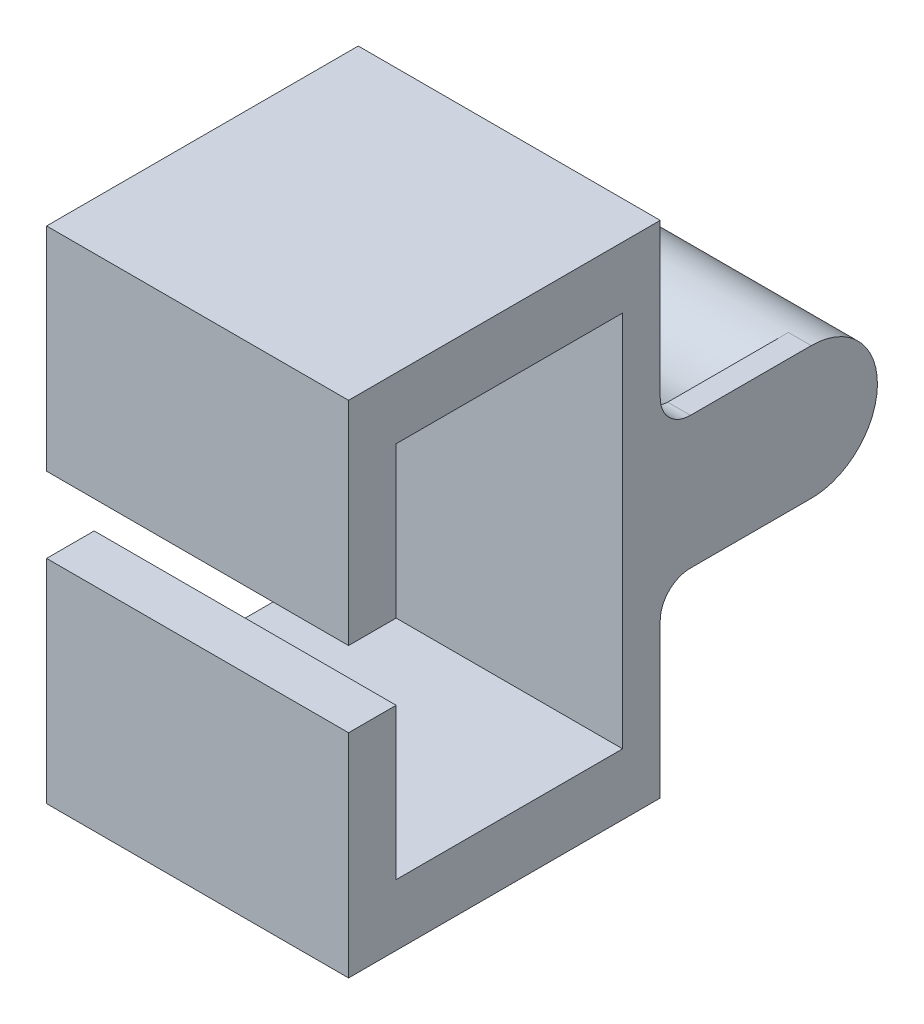
ISO-10303-21;
HEADER;
FILE_DESCRIPTION(('STEP AP214'),'2;1');
FILE_NAME('part.step','',(''),(''),'','','');
FILE_SCHEMA(('AUTOMOTIVE_DESIGN { 1 0 10303 214 1 1 1 1 }'));
ENDSEC;
DATA;
#1=APPLICATION_CONTEXT('core data for automotive mechanical design processes');
#2=APPLICATION_PROTOCOL_DEFINITION('international standard','automotive_design',2000,#1);
#3=PRODUCT_CONTEXT('',#1,'mechanical');
#4=PRODUCT('Part','Part','',(#3));
#5=PRODUCT_RELATED_PRODUCT_CATEGORY('part','',(#4));
#6=PRODUCT_DEFINITION_FORMATION('','',#4);
#7=PRODUCT_DEFINITION_CONTEXT('part definition',#1,'design');
#8=PRODUCT_DEFINITION('design','',#6,#7);
#9=PRODUCT_DEFINITION_SHAPE('','',#8);
#10=(LENGTH_UNIT() NAMED_UNIT(*) SI_UNIT(.MILLI.,.METRE.));
#11=(NAMED_UNIT(*) PLANE_ANGLE_UNIT() SI_UNIT($,.RADIAN.));
#12=(NAMED_UNIT(*) SI_UNIT($,.STERADIAN.) SOLID_ANGLE_UNIT());
#13=UNCERTAINTY_MEASURE_WITH_UNIT(LENGTH_MEASURE(1.E-05),#10,'distance_accuracy_value','');
#14=(GEOMETRIC_REPRESENTATION_CONTEXT(3) GLOBAL_UNCERTAINTY_ASSIGNED_CONTEXT((#13)) GLOBAL_UNIT_ASSIGNED_CONTEXT((#10,
#11,#12)) REPRESENTATION_CONTEXT('',''));
#15=CARTESIAN_POINT('',(0.,0.,0.));
#16=DIRECTION('',(0.,0.,1.));
#17=DIRECTION('',(1.,0.,0.));
#18=AXIS2_PLACEMENT_3D('',#15,#16,#17);
#19=CARTESIAN_POINT('',(50.8,-31.75,25.4));
#20=DIRECTION('',(0.,0.,1.));
#21=DIRECTION('',(1.,0.,0.));
#22=AXIS2_PLACEMENT_3D('',#19,#20,#21);
#23=PLANE('',#22);
#24=DIRECTION('',(0.,1.,0.));
#25=VECTOR('',#24,1.);
#26=CARTESIAN_POINT('',(50.8,-31.75,25.4));
#27=LINE('',#26,#25);
#28=CARTESIAN_POINT('',(50.8,16.2161216276526,25.4));
#29=VERTEX_POINT('',#28);
#30=CARTESIAN_POINT('',(50.8,42.0823482396232,25.4));
#31=VERTEX_POINT('',#30);
#32=EDGE_CURVE('E360',#29,#31,#27,.T.);
#33=ORIENTED_EDGE('',*,*,#32,.F.);
#34=DIRECTION('',(1.,0.,0.));
#35=VECTOR('',#34,1.);
#36=CARTESIAN_POINT('',(50.8,16.2161216276526,25.4));
#37=LINE('',#36,#35);
#38=CARTESIAN_POINT('',(41.8853644342479,16.2161216276526,25.4));
#39=VERTEX_POINT('',#38);
#40=EDGE_CURVE('E422',#29,#39,#37,.F.);
#41=ORIENTED_EDGE('',*,*,#40,.T.);
#42=DIRECTION('',(0.,-1.,0.));
#43=VECTOR('',#42,1.);
#44=CARTESIAN_POINT('',(41.8853644342479,-11.1252,25.4));
#45=LINE('',#44,#43);
#46=CARTESIAN_POINT('',(41.8853644342479,-16.2052,25.4));
#47=VERTEX_POINT('',#46);
#48=EDGE_CURVE('E416',#39,#47,#45,.T.);
#49=ORIENTED_EDGE('',*,*,#48,.T.);
#50=DIRECTION('',(1.,0.,0.));
#51=VECTOR('',#50,1.);
#52=CARTESIAN_POINT('',(50.8,-16.2052,25.4));
#53=LINE('',#52,#51);
#54=CARTESIAN_POINT('',(50.8,-16.2052,25.4));
#55=VERTEX_POINT('',#54);
#56=EDGE_CURVE('E418',#47,#55,#53,.T.);
#57=ORIENTED_EDGE('',*,*,#56,.T.);
#58=CARTESIAN_POINT('',(50.8,-42.0823482396232,25.4));
#59=VERTEX_POINT('',#58);
#60=EDGE_CURVE('E353',#59,#55,#27,.T.);
#61=ORIENTED_EDGE('',*,*,#60,.F.);
#62=DIRECTION('',(-1.,0.,0.));
#63=VECTOR('',#62,1.);
#64=CARTESIAN_POINT('',(50.8,-42.0823482396232,25.4));
#65=LINE('',#64,#63);
#66=CARTESIAN_POINT('',(0.,-42.0823482396232,25.4));
#67=VERTEX_POINT('',#66);
#68=EDGE_CURVE('E316',#59,#67,#65,.T.);
#69=ORIENTED_EDGE('',*,*,#68,.T.);
#70=DIRECTION('',(0.,1.,0.));
#71=VECTOR('',#70,1.);
#72=CARTESIAN_POINT('',(0.,-31.75,25.4));
#73=LINE('',#72,#71);
#74=CARTESIAN_POINT('',(0.,-16.2052,25.4));
#75=VERTEX_POINT('',#74);
#76=EDGE_CURVE('E361',#67,#75,#73,.T.);
#77=ORIENTED_EDGE('',*,*,#76,.T.);
#78=DIRECTION('',(-1.,0.,0.));
#79=VECTOR('',#78,1.);
#80=CARTESIAN_POINT('',(50.8,-16.2052,25.4));
#81=LINE('',#80,#79);
#82=CARTESIAN_POINT('',(8.91463556575211,-16.2052,25.4));
#83=VERTEX_POINT('',#82);
#84=EDGE_CURVE('E409',#75,#83,#81,.F.);
#85=ORIENTED_EDGE('',*,*,#84,.T.);
#86=DIRECTION('',(0.,-1.,0.));
#87=VECTOR('',#86,1.);
#88=CARTESIAN_POINT('',(8.91463556575211,11.1361216276526,25.4));
#89=LINE('',#88,#87);
#90=CARTESIAN_POINT('',(8.91463556575211,16.2161216276526,25.4));
#91=VERTEX_POINT('',#90);
#92=EDGE_CURVE('E408',#83,#91,#89,.F.);
#93=ORIENTED_EDGE('',*,*,#92,.T.);
#94=DIRECTION('',(-1.,0.,0.));
#95=VECTOR('',#94,1.);
#96=CARTESIAN_POINT('',(0.,16.2161216276526,25.4));
#97=LINE('',#96,#95);
#98=CARTESIAN_POINT('',(0.,16.2161216276526,25.4));
#99=VERTEX_POINT('',#98);
#100=EDGE_CURVE('E415',#91,#99,#97,.T.);
#101=ORIENTED_EDGE('',*,*,#100,.T.);
#102=CARTESIAN_POINT('',(0.,42.0823482396232,25.4));
#103=VERTEX_POINT('',#102);
#104=EDGE_CURVE('E333',#99,#103,#73,.T.);
#105=ORIENTED_EDGE('',*,*,#104,.T.);
#106=DIRECTION('',(-1.,0.,0.));
#107=VECTOR('',#106,1.);
#108=CARTESIAN_POINT('',(50.8,42.0823482396232,25.4));
#109=LINE('',#108,#107);
#110=EDGE_CURVE('E281',#31,#103,#109,.T.);
#111=ORIENTED_EDGE('',*,*,#110,.F.);
#112=EDGE_LOOP('',(#33,#41,#49,#57,#61,#69,#77,#85,#93,#101,#105,#111));
#113=FACE_BOUND('',#112,.T.);
#114=ADVANCED_FACE('F50',(#113),#23,.F.);
#115=CARTESIAN_POINT('',(50.8,0.,0.));
#116=DIRECTION('',(-1.,0.,0.));
#117=DIRECTION('',(0.,0.,1.));
#118=AXIS2_PLACEMENT_3D('',#115,#116,#117);
#119=CYLINDRICAL_SURFACE('',#118,11.1361216276526);
#120=CARTESIAN_POINT('',(50.8,0.,0.));
#121=DIRECTION('',(1.,0.,0.));
#122=DIRECTION('',(0.,0.,-1.));
#123=AXIS2_PLACEMENT_3D('',#120,#121,#122);
#124=CIRCLE('',#123,11.1361216276526);
#125=CARTESIAN_POINT('',(50.8,-11.1252,0.493082007248803));
#126=VERTEX_POINT('',#125);
#127=CARTESIAN_POINT('',(50.8,11.1361216276526,0.));
#128=VERTEX_POINT('',#127);
#129=EDGE_CURVE('E234',#126,#128,#124,.T.);
#130=ORIENTED_EDGE('',*,*,#129,.F.);
#131=DIRECTION('',(-1.,0.,0.));
#132=VECTOR('',#131,1.);
#133=CARTESIAN_POINT('',(50.8,-11.1252,0.493082007248858));
#134=LINE('',#133,#132);
#135=CARTESIAN_POINT('',(46.9653644342479,-11.1252,0.493082007248803));
#136=VERTEX_POINT('',#135);
#137=EDGE_CURVE('E220',#126,#136,#134,.T.);
#138=ORIENTED_EDGE('',*,*,#137,.T.);
#139=CARTESIAN_POINT('',(46.9653644342479,0.,0.));
#140=DIRECTION('',(1.,0.,0.));
#141=DIRECTION('',(0.,0.,-1.));
#142=AXIS2_PLACEMENT_3D('',#139,#140,#141);
#143=CIRCLE('',#142,11.1361216276526);
#144=CARTESIAN_POINT('',(46.9653644342479,11.1361216276526,0.));
#145=VERTEX_POINT('',#144);
#146=EDGE_CURVE('E233',#145,#136,#143,.T.);
#147=ORIENTED_EDGE('',*,*,#146,.F.);
#148=DIRECTION('',(1.,0.,0.));
#149=VECTOR('',#148,1.);
#150=CARTESIAN_POINT('',(46.9653644342479,11.1361216276526,0.));
#151=LINE('',#150,#149);
#152=EDGE_CURVE('E245',#145,#128,#151,.T.);
#153=ORIENTED_EDGE('',*,*,#152,.T.);
#154=EDGE_LOOP('',(#130,#138,#147,#153));
#155=FACE_BOUND('',#154,.T.);
#156=DIRECTION('',(-1.,0.,0.));
#157=VECTOR('',#156,1.);
#158=CARTESIAN_POINT('',(3.83463556575211,11.1361216276526,0.));
#159=LINE('',#158,#157);
#160=CARTESIAN_POINT('',(3.83463556575211,11.1361216276526,0.));
#161=VERTEX_POINT('',#160);
#162=CARTESIAN_POINT('',(0.,11.1361216276526,0.));
#163=VERTEX_POINT('',#162);
#164=EDGE_CURVE('E383',#161,#163,#159,.T.);
#165=ORIENTED_EDGE('',*,*,#164,.F.);
#166=CARTESIAN_POINT('',(3.83463556575211,0.,0.));
#167=DIRECTION('',(-1.,0.,0.));
#168=DIRECTION('',(0.,0.,1.));
#169=AXIS2_PLACEMENT_3D('',#166,#167,#168);
#170=CIRCLE('',#169,11.1361216276526);
#171=CARTESIAN_POINT('',(3.83463556575211,-11.1252,0.493082007248803));
#172=VERTEX_POINT('',#171);
#173=EDGE_CURVE('E399',#172,#161,#170,.T.);
#174=ORIENTED_EDGE('',*,*,#173,.F.);
#175=DIRECTION('',(-1.,0.,0.));
#176=VECTOR('',#175,1.);
#177=CARTESIAN_POINT('',(50.8,-11.1252,0.493082007248858));
#178=LINE('',#177,#176);
#179=CARTESIAN_POINT('',(0.,-11.1252,0.493082007248803));
#180=VERTEX_POINT('',#179);
#181=EDGE_CURVE('E393',#172,#180,#178,.T.);
#182=ORIENTED_EDGE('',*,*,#181,.T.);
#183=CARTESIAN_POINT('',(0.,0.,0.));
#184=DIRECTION('',(1.,0.,0.));
#185=DIRECTION('',(0.,0.,-1.));
#186=AXIS2_PLACEMENT_3D('',#183,#184,#185);
#187=CIRCLE('',#186,11.1361216276526);
#188=EDGE_CURVE('E400',#180,#163,#187,.T.);
#189=ORIENTED_EDGE('',*,*,#188,.T.);
#190=EDGE_LOOP('',(#165,#174,#182,#189));
#191=FACE_BOUND('',#190,.T.);
#192=ADVANCED_FACE('F230',(#155,#191),#119,.T.);
#193=CARTESIAN_POINT('',(50.8,0.,0.));
#194=DIRECTION('',(1.,0.,0.));
#195=DIRECTION('',(0.,0.,-1.));
#196=AXIS2_PLACEMENT_3D('',#193,#194,#195);
#197=PLANE('',#196);
#198=ORIENTED_EDGE('',*,*,#129,.T.);
#199=DIRECTION('',(0.,0.,1.));
#200=VECTOR('',#199,1.);
#201=CARTESIAN_POINT('',(50.8,11.1361216276526,25.4));
#202=LINE('',#201,#200);
#203=CARTESIAN_POINT('',(50.8,11.1361216276526,20.32));
#204=VERTEX_POINT('',#203);
#205=EDGE_CURVE('E224',#128,#204,#202,.T.);
#206=ORIENTED_EDGE('',*,*,#205,.T.);
#207=CARTESIAN_POINT('',(50.8,16.2161216276526,20.32));
#208=DIRECTION('',(1.,0.,0.));
#209=DIRECTION('',(0.,0.,-1.));
#210=AXIS2_PLACEMENT_3D('',#207,#208,#209);
#211=CIRCLE('',#210,5.08);
#212=EDGE_CURVE('E443',#204,#29,#211,.F.);
#213=ORIENTED_EDGE('',*,*,#212,.T.);
#214=ORIENTED_EDGE('',*,*,#32,.T.);
#215=DIRECTION('',(0.,0.,1.));
#216=VECTOR('',#215,1.);
#217=CARTESIAN_POINT('',(50.8,42.0823482396232,25.4));
#218=LINE('',#217,#216);
#219=CARTESIAN_POINT('',(50.8,42.0823482396232,77.8306477898105));
#220=VERTEX_POINT('',#219);
#221=EDGE_CURVE('E341',#31,#220,#218,.T.);
#222=ORIENTED_EDGE('',*,*,#221,.T.);
#223=DIRECTION('',(0.,-1.,0.));
#224=VECTOR('',#223,1.);
#225=CARTESIAN_POINT('',(50.8,42.0823482396232,77.8306477898105));
#226=LINE('',#225,#224);
#227=CARTESIAN_POINT('',(50.8,6.35,77.8306477898105));
#228=VERTEX_POINT('',#227);
#229=EDGE_CURVE('E296',#220,#228,#226,.T.);
#230=ORIENTED_EDGE('',*,*,#229,.T.);
#231=DIRECTION('',(0.,0.,-1.));
#232=VECTOR('',#231,1.);
#233=CARTESIAN_POINT('',(50.8,6.35,69.8272452579552));
#234=LINE('',#233,#232);
#235=CARTESIAN_POINT('',(50.8,6.35,69.8272452579552));
#236=VERTEX_POINT('',#235);
#237=EDGE_CURVE('E306',#228,#236,#234,.T.);
#238=ORIENTED_EDGE('',*,*,#237,.T.);
#239=DIRECTION('',(0.,1.,0.));
#240=VECTOR('',#239,1.);
#241=CARTESIAN_POINT('',(50.8,42.0823482396232,69.8272452579552));
#242=LINE('',#241,#240);
#243=CARTESIAN_POINT('',(50.8,31.75,69.8272452579552));
#244=VERTEX_POINT('',#243);
#245=EDGE_CURVE('E291',#236,#244,#242,.T.);
#246=ORIENTED_EDGE('',*,*,#245,.T.);
#247=DIRECTION('',(0.,0.,-1.));
#248=VECTOR('',#247,1.);
#249=CARTESIAN_POINT('',(50.8,31.75,25.4));
#250=LINE('',#249,#248);
#251=CARTESIAN_POINT('',(50.8,31.75,31.7272452579552));
#252=VERTEX_POINT('',#251);
#253=EDGE_CURVE('E346',#244,#252,#250,.T.);
#254=ORIENTED_EDGE('',*,*,#253,.T.);
#255=DIRECTION('',(0.,-1.,0.));
#256=VECTOR('',#255,1.);
#257=CARTESIAN_POINT('',(50.8,-31.75,31.7272452579552));
#258=LINE('',#257,#256);
#259=CARTESIAN_POINT('',(50.8,-31.75,31.7272452579552));
#260=VERTEX_POINT('',#259);
#261=EDGE_CURVE('E356',#252,#260,#258,.T.);
#262=ORIENTED_EDGE('',*,*,#261,.T.);
#263=DIRECTION('',(0.,0.,1.));
#264=VECTOR('',#263,1.);
#265=CARTESIAN_POINT('',(50.8,-31.75,25.4));
#266=LINE('',#265,#264);
#267=CARTESIAN_POINT('',(50.8,-31.75,69.8272452579552));
#268=VERTEX_POINT('',#267);
#269=EDGE_CURVE('E311',#260,#268,#266,.T.);
#270=ORIENTED_EDGE('',*,*,#269,.T.);
#271=DIRECTION('',(0.,1.,0.));
#272=VECTOR('',#271,1.);
#273=CARTESIAN_POINT('',(50.8,-42.0823482396232,69.8272452579552));
#274=LINE('',#273,#272);
#275=CARTESIAN_POINT('',(50.8,-6.35,69.8272452579552));
#276=VERTEX_POINT('',#275);
#277=EDGE_CURVE('E247',#268,#276,#274,.T.);
#278=ORIENTED_EDGE('',*,*,#277,.T.);
#279=DIRECTION('',(0.,0.,1.));
#280=VECTOR('',#279,1.);
#281=CARTESIAN_POINT('',(50.8,-6.35,69.8272452579552));
#282=LINE('',#281,#280);
#283=CARTESIAN_POINT('',(50.8,-6.35,77.8306477898105));
#284=VERTEX_POINT('',#283);
#285=EDGE_CURVE('E252',#276,#284,#282,.T.);
#286=ORIENTED_EDGE('',*,*,#285,.T.);
#287=DIRECTION('',(0.,-1.,0.));
#288=VECTOR('',#287,1.);
#289=CARTESIAN_POINT('',(50.8,-42.0823482396232,77.8306477898105));
#290=LINE('',#289,#288);
#291=CARTESIAN_POINT('',(50.8,-42.0823482396232,77.8306477898105));
#292=VERTEX_POINT('',#291);
#293=EDGE_CURVE('E253',#284,#292,#290,.T.);
#294=ORIENTED_EDGE('',*,*,#293,.T.);
#295=DIRECTION('',(0.,0.,-1.));
#296=VECTOR('',#295,1.);
#297=CARTESIAN_POINT('',(50.8,-42.0823482396232,25.4));
#298=LINE('',#297,#296);
#299=EDGE_CURVE('E313',#292,#59,#298,.T.);
#300=ORIENTED_EDGE('',*,*,#299,.T.);
#301=ORIENTED_EDGE('',*,*,#60,.T.);
#302=CARTESIAN_POINT('',(50.8,-16.2052,20.32));
#303=DIRECTION('',(1.,0.,0.));
#304=DIRECTION('',(0.,0.,-1.));
#305=AXIS2_PLACEMENT_3D('',#302,#303,#304);
#306=CIRCLE('',#305,5.08);
#307=CARTESIAN_POINT('',(50.8,-11.1252,20.32));
#308=VERTEX_POINT('',#307);
#309=EDGE_CURVE('E60',#55,#308,#306,.F.);
#310=ORIENTED_EDGE('',*,*,#309,.T.);
#311=DIRECTION('',(0.,0.,-1.));
#312=VECTOR('',#311,1.);
#313=CARTESIAN_POINT('',(50.8,-11.1252,25.4));
#314=LINE('',#313,#312);
#315=EDGE_CURVE('E456',#308,#126,#314,.T.);
#316=ORIENTED_EDGE('',*,*,#315,.T.);
#317=EDGE_LOOP('',(#198,#206,#213,#214,#222,#230,#238,#246,#254,#262,#270,#278,#286,#294,#300,
#301,#310,#316));
#318=FACE_BOUND('',#317,.T.);
#319=ADVANCED_FACE('F476',(#318),#197,.T.);
#320=CARTESIAN_POINT('',(0.,0.,0.));
#321=DIRECTION('',(1.,0.,0.));
#322=DIRECTION('',(0.,0.,-1.));
#323=AXIS2_PLACEMENT_3D('',#320,#321,#322);
#324=PLANE('',#323);
#325=ORIENTED_EDGE('',*,*,#188,.F.);
#326=DIRECTION('',(0.,0.,1.));
#327=VECTOR('',#326,1.);
#328=CARTESIAN_POINT('',(0.,-11.1252,0.));
#329=LINE('',#328,#327);
#330=CARTESIAN_POINT('',(0.,-11.1252,20.32));
#331=VERTEX_POINT('',#330);
#332=EDGE_CURVE('E380',#180,#331,#329,.T.);
#333=ORIENTED_EDGE('',*,*,#332,.T.);
#334=CARTESIAN_POINT('',(0.,-16.2052,20.32));
#335=DIRECTION('',(1.,0.,0.));
#336=DIRECTION('',(0.,0.,-1.));
#337=AXIS2_PLACEMENT_3D('',#334,#335,#336);
#338=CIRCLE('',#337,5.08);
#339=EDGE_CURVE('E11',#331,#75,#338,.T.);
#340=ORIENTED_EDGE('',*,*,#339,.T.);
#341=ORIENTED_EDGE('',*,*,#76,.F.);
#342=DIRECTION('',(0.,0.,-1.));
#343=VECTOR('',#342,1.);
#344=CARTESIAN_POINT('',(0.,-42.0823482396232,25.4));
#345=LINE('',#344,#343);
#346=CARTESIAN_POINT('',(0.,-42.0823482396232,77.8306477898105));
#347=VERTEX_POINT('',#346);
#348=EDGE_CURVE('E314',#347,#67,#345,.T.);
#349=ORIENTED_EDGE('',*,*,#348,.F.);
#350=DIRECTION('',(0.,-1.,0.));
#351=VECTOR('',#350,1.);
#352=CARTESIAN_POINT('',(0.,-42.0823482396232,77.8306477898105));
#353=LINE('',#352,#351);
#354=CARTESIAN_POINT('',(0.,-6.35,77.8306477898105));
#355=VERTEX_POINT('',#354);
#356=EDGE_CURVE('E255',#355,#347,#353,.T.);
#357=ORIENTED_EDGE('',*,*,#356,.F.);
#358=DIRECTION('',(0.,0.,1.));
#359=VECTOR('',#358,1.);
#360=CARTESIAN_POINT('',(0.,-6.35,69.8272452579552));
#361=LINE('',#360,#359);
#362=CARTESIAN_POINT('',(0.,-6.35,69.8272452579552));
#363=VERTEX_POINT('',#362);
#364=EDGE_CURVE('E262',#363,#355,#361,.T.);
#365=ORIENTED_EDGE('',*,*,#364,.F.);
#366=DIRECTION('',(0.,1.,0.));
#367=VECTOR('',#366,1.);
#368=CARTESIAN_POINT('',(0.,-42.0823482396232,69.8272452579552));
#369=LINE('',#368,#367);
#370=CARTESIAN_POINT('',(0.,-31.75,69.8272452579552));
#371=VERTEX_POINT('',#370);
#372=EDGE_CURVE('E257',#371,#363,#369,.T.);
#373=ORIENTED_EDGE('',*,*,#372,.F.);
#374=DIRECTION('',(0.,0.,1.));
#375=VECTOR('',#374,1.);
#376=CARTESIAN_POINT('',(0.,-31.75,25.4));
#377=LINE('',#376,#375);
#378=CARTESIAN_POINT('',(0.,-31.75,31.7272452579552));
#379=VERTEX_POINT('',#378);
#380=EDGE_CURVE('E318',#379,#371,#377,.T.);
#381=ORIENTED_EDGE('',*,*,#380,.F.);
#382=DIRECTION('',(0.,-1.,0.));
#383=VECTOR('',#382,1.);
#384=CARTESIAN_POINT('',(0.,-31.75,31.7272452579552));
#385=LINE('',#384,#383);
#386=CARTESIAN_POINT('',(0.,31.75,31.7272452579552));
#387=VERTEX_POINT('',#386);
#388=EDGE_CURVE('E370',#387,#379,#385,.T.);
#389=ORIENTED_EDGE('',*,*,#388,.F.);
#390=DIRECTION('',(0.,0.,-1.));
#391=VECTOR('',#390,1.);
#392=CARTESIAN_POINT('',(0.,31.75,25.4));
#393=LINE('',#392,#391);
#394=CARTESIAN_POINT('',(0.,31.75,69.8272452579552));
#395=VERTEX_POINT('',#394);
#396=EDGE_CURVE('E325',#395,#387,#393,.T.);
#397=ORIENTED_EDGE('',*,*,#396,.F.);
#398=DIRECTION('',(0.,1.,0.));
#399=VECTOR('',#398,1.);
#400=CARTESIAN_POINT('',(0.,42.0823482396232,69.8272452579552));
#401=LINE('',#400,#399);
#402=CARTESIAN_POINT('',(0.,6.35,69.8272452579552));
#403=VERTEX_POINT('',#402);
#404=EDGE_CURVE('E295',#403,#395,#401,.T.);
#405=ORIENTED_EDGE('',*,*,#404,.F.);
#406=DIRECTION('',(0.,0.,-1.));
#407=VECTOR('',#406,1.);
#408=CARTESIAN_POINT('',(0.,6.35,69.8272452579552));
#409=LINE('',#408,#407);
#410=CARTESIAN_POINT('',(0.,6.35,77.8306477898105));
#411=VERTEX_POINT('',#410);
#412=EDGE_CURVE('E300',#411,#403,#409,.T.);
#413=ORIENTED_EDGE('',*,*,#412,.F.);
#414=DIRECTION('',(0.,-1.,0.));
#415=VECTOR('',#414,1.);
#416=CARTESIAN_POINT('',(0.,42.0823482396232,77.8306477898105));
#417=LINE('',#416,#415);
#418=CARTESIAN_POINT('',(0.,42.0823482396232,77.8306477898105));
#419=VERTEX_POINT('',#418);
#420=EDGE_CURVE('E263',#419,#411,#417,.T.);
#421=ORIENTED_EDGE('',*,*,#420,.F.);
#422=DIRECTION('',(0.,0.,1.));
#423=VECTOR('',#422,1.);
#424=CARTESIAN_POINT('',(0.,42.0823482396232,25.4));
#425=LINE('',#424,#423);
#426=EDGE_CURVE('E345',#103,#419,#425,.T.);
#427=ORIENTED_EDGE('',*,*,#426,.F.);
#428=ORIENTED_EDGE('',*,*,#104,.F.);
#429=CARTESIAN_POINT('',(0.,16.2161216276526,20.32));
#430=DIRECTION('',(1.,0.,0.));
#431=DIRECTION('',(0.,0.,-1.));
#432=AXIS2_PLACEMENT_3D('',#429,#430,#431);
#433=CIRCLE('',#432,5.08);
#434=CARTESIAN_POINT('',(0.,11.1361216276526,20.32));
#435=VERTEX_POINT('',#434);
#436=EDGE_CURVE('E441',#99,#435,#433,.T.);
#437=ORIENTED_EDGE('',*,*,#436,.T.);
#438=DIRECTION('',(0.,0.,1.));
#439=VECTOR('',#438,1.);
#440=CARTESIAN_POINT('',(0.,11.1361216276526,0.));
#441=LINE('',#440,#439);
#442=EDGE_CURVE('E385',#163,#435,#441,.T.);
#443=ORIENTED_EDGE('',*,*,#442,.F.);
#444=EDGE_LOOP('',(#325,#333,#340,#341,#349,#357,#365,#373,#381,#389,#397,#405,#413,#421,#427,
#428,#437,#443));
#445=FACE_BOUND('',#444,.T.);
#446=ADVANCED_FACE('F498',(#445),#324,.F.);
#447=CARTESIAN_POINT('',(3.83463556575211,-11.1252,0.));
#448=DIRECTION('',(0.,-1.,0.));
#449=DIRECTION('',(0.,0.,-1.));
#450=AXIS2_PLACEMENT_3D('',#447,#448,#449);
#451=PLANE('',#450);
#452=DIRECTION('',(0.,0.,1.));
#453=VECTOR('',#452,1.);
#454=CARTESIAN_POINT('',(3.83463556575211,-11.1252,0.));
#455=LINE('',#454,#453);
#456=CARTESIAN_POINT('',(3.83463556575211,-11.1252,20.32));
#457=VERTEX_POINT('',#456);
#458=EDGE_CURVE('E377',#172,#457,#455,.T.);
#459=ORIENTED_EDGE('',*,*,#458,.T.);
#460=DIRECTION('',(-1.,0.,0.));
#461=VECTOR('',#460,1.);
#462=CARTESIAN_POINT('',(3.83463556575211,-11.1252,20.32));
#463=LINE('',#462,#461);
#464=EDGE_CURVE('E62',#457,#331,#463,.T.);
#465=ORIENTED_EDGE('',*,*,#464,.T.);
#466=ORIENTED_EDGE('',*,*,#332,.F.);
#467=ORIENTED_EDGE('',*,*,#181,.F.);
#468=EDGE_LOOP('',(#459,#465,#466,#467));
#469=FACE_BOUND('',#468,.T.);
#470=ADVANCED_FACE('F572',(#469),#451,.T.);
#471=CARTESIAN_POINT('',(3.83463556575211,11.1361216276526,0.));
#472=DIRECTION('',(0.,-1.,0.));
#473=DIRECTION('',(0.,0.,-1.));
#474=AXIS2_PLACEMENT_3D('',#471,#472,#473);
#475=PLANE('',#474);
#476=ORIENTED_EDGE('',*,*,#442,.T.);
#477=DIRECTION('',(-1.,0.,0.));
#478=VECTOR('',#477,1.);
#479=CARTESIAN_POINT('',(3.83463556575211,11.1361216276526,20.32));
#480=LINE('',#479,#478);
#481=CARTESIAN_POINT('',(3.83463556575211,11.1361216276526,20.32));
#482=VERTEX_POINT('',#481);
#483=EDGE_CURVE('E424',#435,#482,#480,.F.);
#484=ORIENTED_EDGE('',*,*,#483,.T.);
#485=DIRECTION('',(0.,0.,1.));
#486=VECTOR('',#485,1.);
#487=CARTESIAN_POINT('',(3.83463556575211,11.1361216276526,0.));
#488=LINE('',#487,#486);
#489=EDGE_CURVE('E382',#161,#482,#488,.T.);
#490=ORIENTED_EDGE('',*,*,#489,.F.);
#491=ORIENTED_EDGE('',*,*,#164,.T.);
#492=EDGE_LOOP('',(#476,#484,#490,#491));
#493=FACE_BOUND('',#492,.T.);
#494=ADVANCED_FACE('F569',(#493),#475,.F.);
#495=CARTESIAN_POINT('',(3.83463556575211,0.,0.));
#496=DIRECTION('',(-1.,0.,0.));
#497=DIRECTION('',(0.,0.,1.));
#498=AXIS2_PLACEMENT_3D('',#495,#496,#497);
#499=PLANE('',#498);
#500=ORIENTED_EDGE('',*,*,#489,.T.);
#501=DIRECTION('',(0.,-1.,0.));
#502=VECTOR('',#501,1.);
#503=CARTESIAN_POINT('',(3.83463556575211,-11.1252,20.32));
#504=LINE('',#503,#502);
#505=EDGE_CURVE('E72',#482,#457,#504,.T.);
#506=ORIENTED_EDGE('',*,*,#505,.T.);
#507=ORIENTED_EDGE('',*,*,#458,.F.);
#508=ORIENTED_EDGE('',*,*,#173,.T.);
#509=EDGE_LOOP('',(#500,#506,#507,#508));
#510=FACE_BOUND('',#509,.T.);
#511=ADVANCED_FACE('F570',(#510),#499,.F.);
#512=CARTESIAN_POINT('',(50.8,-31.75,31.7272452579552));
#513=DIRECTION('',(0.,0.,-1.));
#514=DIRECTION('',(-1.,0.,0.));
#515=AXIS2_PLACEMENT_3D('',#512,#513,#514);
#516=PLANE('',#515);
#517=ORIENTED_EDGE('',*,*,#388,.T.);
#518=DIRECTION('',(-1.,0.,0.));
#519=VECTOR('',#518,1.);
#520=CARTESIAN_POINT('',(50.8,-31.75,31.7272452579552));
#521=LINE('',#520,#519);
#522=EDGE_CURVE('E365',#260,#379,#521,.T.);
#523=ORIENTED_EDGE('',*,*,#522,.F.);
#524=ORIENTED_EDGE('',*,*,#261,.F.);
#525=DIRECTION('',(-1.,0.,0.));
#526=VECTOR('',#525,1.);
#527=CARTESIAN_POINT('',(50.8,31.75,31.7272452579552));
#528=LINE('',#527,#526);
#529=EDGE_CURVE('E373',#252,#387,#528,.T.);
#530=ORIENTED_EDGE('',*,*,#529,.T.);
#531=EDGE_LOOP('',(#517,#523,#524,#530));
#532=FACE_BOUND('',#531,.T.);
#533=ADVANCED_FACE('F529',(#532),#516,.F.);
#534=CARTESIAN_POINT('',(50.8,31.75,25.4));
#535=DIRECTION('',(0.,1.,0.));
#536=DIRECTION('',(0.,0.,1.));
#537=AXIS2_PLACEMENT_3D('',#534,#535,#536);
#538=PLANE('',#537);
#539=ORIENTED_EDGE('',*,*,#529,.F.);
#540=ORIENTED_EDGE('',*,*,#253,.F.);
#541=DIRECTION('',(-1.,0.,0.));
#542=VECTOR('',#541,1.);
#543=CARTESIAN_POINT('',(50.8,31.75,69.8272452579552));
#544=LINE('',#543,#542);
#545=EDGE_CURVE('E336',#244,#395,#544,.T.);
#546=ORIENTED_EDGE('',*,*,#545,.T.);
#547=ORIENTED_EDGE('',*,*,#396,.T.);
#548=EDGE_LOOP('',(#539,#540,#546,#547));
#549=FACE_BOUND('',#548,.T.);
#550=ADVANCED_FACE('F523',(#549),#538,.F.);
#551=CARTESIAN_POINT('',(50.8,42.0823482396232,25.4));
#552=DIRECTION('',(0.,-1.,0.));
#553=DIRECTION('',(0.,0.,-1.));
#554=AXIS2_PLACEMENT_3D('',#551,#552,#553);
#555=PLANE('',#554);
#556=ORIENTED_EDGE('',*,*,#426,.T.);
#557=DIRECTION('',(-1.,0.,0.));
#558=VECTOR('',#557,1.);
#559=CARTESIAN_POINT('',(50.8,42.0823482396232,77.8306477898105));
#560=LINE('',#559,#558);
#561=EDGE_CURVE('E236',#220,#419,#560,.T.);
#562=ORIENTED_EDGE('',*,*,#561,.F.);
#563=ORIENTED_EDGE('',*,*,#221,.F.);
#564=ORIENTED_EDGE('',*,*,#110,.T.);
#565=EDGE_LOOP('',(#556,#562,#563,#564));
#566=FACE_BOUND('',#565,.T.);
#567=ADVANCED_FACE('F507',(#566),#555,.F.);
#568=CARTESIAN_POINT('',(50.8,-31.75,25.4));
#569=DIRECTION('',(0.,-1.,0.));
#570=DIRECTION('',(0.,0.,-1.));
#571=AXIS2_PLACEMENT_3D('',#568,#569,#570);
#572=PLANE('',#571);
#573=ORIENTED_EDGE('',*,*,#269,.F.);
#574=ORIENTED_EDGE('',*,*,#522,.T.);
#575=ORIENTED_EDGE('',*,*,#380,.T.);
#576=DIRECTION('',(-1.,0.,0.));
#577=VECTOR('',#576,1.);
#578=CARTESIAN_POINT('',(50.8,-31.75,69.8272452579552));
#579=LINE('',#578,#577);
#580=EDGE_CURVE('E329',#268,#371,#579,.T.);
#581=ORIENTED_EDGE('',*,*,#580,.F.);
#582=EDGE_LOOP('',(#573,#574,#575,#581));
#583=FACE_BOUND('',#582,.T.);
#584=ADVANCED_FACE('F534',(#583),#572,.F.);
#585=CARTESIAN_POINT('',(50.8,-42.0823482396232,25.4));
#586=DIRECTION('',(0.,1.,0.));
#587=DIRECTION('',(0.,0.,1.));
#588=AXIS2_PLACEMENT_3D('',#585,#586,#587);
#589=PLANE('',#588);
#590=ORIENTED_EDGE('',*,*,#348,.T.);
#591=ORIENTED_EDGE('',*,*,#68,.F.);
#592=ORIENTED_EDGE('',*,*,#299,.F.);
#593=DIRECTION('',(-1.,0.,0.));
#594=VECTOR('',#593,1.);
#595=CARTESIAN_POINT('',(50.8,-42.0823482396232,77.8306477898105));
#596=LINE('',#595,#594);
#597=EDGE_CURVE('E258',#292,#347,#596,.T.);
#598=ORIENTED_EDGE('',*,*,#597,.T.);
#599=EDGE_LOOP('',(#590,#591,#592,#598));
#600=FACE_BOUND('',#599,.T.);
#601=ADVANCED_FACE('F481',(#600),#589,.F.);
#602=CARTESIAN_POINT('',(50.8,-42.0823482396232,69.8272452579552));
#603=DIRECTION('',(0.,0.,1.));
#604=DIRECTION('',(0.,-1.,0.));
#605=AXIS2_PLACEMENT_3D('',#602,#603,#604);
#606=PLANE('',#605);
#607=ORIENTED_EDGE('',*,*,#277,.F.);
#608=ORIENTED_EDGE('',*,*,#580,.T.);
#609=ORIENTED_EDGE('',*,*,#372,.T.);
#610=DIRECTION('',(-1.,0.,0.));
#611=VECTOR('',#610,1.);
#612=CARTESIAN_POINT('',(50.8,-6.35,69.8272452579552));
#613=LINE('',#612,#611);
#614=EDGE_CURVE('E276',#276,#363,#613,.T.);
#615=ORIENTED_EDGE('',*,*,#614,.F.);
#616=EDGE_LOOP('',(#607,#608,#609,#615));
#617=FACE_BOUND('',#616,.T.);
#618=ADVANCED_FACE('F541',(#617),#606,.F.);
#619=CARTESIAN_POINT('',(50.8,-6.35,69.8272452579552));
#620=DIRECTION('',(0.,-1.,0.));
#621=DIRECTION('',(0.,0.,-1.));
#622=AXIS2_PLACEMENT_3D('',#619,#620,#621);
#623=PLANE('',#622);
#624=ORIENTED_EDGE('',*,*,#364,.T.);
#625=DIRECTION('',(-1.,0.,0.));
#626=VECTOR('',#625,1.);
#627=CARTESIAN_POINT('',(50.8,-6.35,77.8306477898105));
#628=LINE('',#627,#626);
#629=EDGE_CURVE('E271',#284,#355,#628,.T.);
#630=ORIENTED_EDGE('',*,*,#629,.F.);
#631=ORIENTED_EDGE('',*,*,#285,.F.);
#632=ORIENTED_EDGE('',*,*,#614,.T.);
#633=EDGE_LOOP('',(#624,#630,#631,#632));
#634=FACE_BOUND('',#633,.T.);
#635=ADVANCED_FACE('F543',(#634),#623,.F.);
#636=CARTESIAN_POINT('',(50.8,-42.0823482396232,77.8306477898105));
#637=DIRECTION('',(0.,0.,-1.));
#638=DIRECTION('',(-1.,0.,0.));
#639=AXIS2_PLACEMENT_3D('',#636,#637,#638);
#640=PLANE('',#639);
#641=ORIENTED_EDGE('',*,*,#356,.T.);
#642=ORIENTED_EDGE('',*,*,#597,.F.);
#643=ORIENTED_EDGE('',*,*,#293,.F.);
#644=ORIENTED_EDGE('',*,*,#629,.T.);
#645=EDGE_LOOP('',(#641,#642,#643,#644));
#646=FACE_BOUND('',#645,.T.);
#647=ADVANCED_FACE('F550',(#646),#640,.F.);
#648=CARTESIAN_POINT('',(50.8,42.0823482396232,77.8306477898105));
#649=DIRECTION('',(0.,0.,-1.));
#650=DIRECTION('',(-1.,0.,0.));
#651=AXIS2_PLACEMENT_3D('',#648,#649,#650);
#652=PLANE('',#651);
#653=ORIENTED_EDGE('',*,*,#420,.T.);
#654=DIRECTION('',(-1.,0.,0.));
#655=VECTOR('',#654,1.);
#656=CARTESIAN_POINT('',(50.8,6.35,77.8306477898105));
#657=LINE('',#656,#655);
#658=EDGE_CURVE('E284',#228,#411,#657,.T.);
#659=ORIENTED_EDGE('',*,*,#658,.F.);
#660=ORIENTED_EDGE('',*,*,#229,.F.);
#661=ORIENTED_EDGE('',*,*,#561,.T.);
#662=EDGE_LOOP('',(#653,#659,#660,#661));
#663=FACE_BOUND('',#662,.T.);
#664=ADVANCED_FACE('F509',(#663),#652,.F.);
#665=CARTESIAN_POINT('',(50.8,6.35,69.8272452579552));
#666=DIRECTION('',(0.,1.,0.));
#667=DIRECTION('',(0.,0.,1.));
#668=AXIS2_PLACEMENT_3D('',#665,#666,#667);
#669=PLANE('',#668);
#670=ORIENTED_EDGE('',*,*,#412,.T.);
#671=DIRECTION('',(-1.,0.,0.));
#672=VECTOR('',#671,1.);
#673=CARTESIAN_POINT('',(50.8,6.35,69.8272452579552));
#674=LINE('',#673,#672);
#675=EDGE_CURVE('E288',#236,#403,#674,.T.);
#676=ORIENTED_EDGE('',*,*,#675,.F.);
#677=ORIENTED_EDGE('',*,*,#237,.F.);
#678=ORIENTED_EDGE('',*,*,#658,.T.);
#679=EDGE_LOOP('',(#670,#676,#677,#678));
#680=FACE_BOUND('',#679,.T.);
#681=ADVANCED_FACE('F516',(#680),#669,.F.);
#682=CARTESIAN_POINT('',(50.8,42.0823482396232,69.8272452579552));
#683=DIRECTION('',(0.,0.,1.));
#684=DIRECTION('',(1.,0.,0.));
#685=AXIS2_PLACEMENT_3D('',#682,#683,#684);
#686=PLANE('',#685);
#687=ORIENTED_EDGE('',*,*,#545,.F.);
#688=ORIENTED_EDGE('',*,*,#245,.F.);
#689=ORIENTED_EDGE('',*,*,#675,.T.);
#690=ORIENTED_EDGE('',*,*,#404,.T.);
#691=EDGE_LOOP('',(#687,#688,#689,#690));
#692=FACE_BOUND('',#691,.T.);
#693=ADVANCED_FACE('F521',(#692),#686,.F.);
#694=CARTESIAN_POINT('',(46.9653644342479,-11.1252,25.4));
#695=DIRECTION('',(0.,-1.,0.));
#696=DIRECTION('',(0.,0.,-1.));
#697=AXIS2_PLACEMENT_3D('',#694,#695,#696);
#698=PLANE('',#697);
#699=ORIENTED_EDGE('',*,*,#315,.F.);
#700=DIRECTION('',(1.,0.,0.));
#701=VECTOR('',#700,1.);
#702=CARTESIAN_POINT('',(46.9653644342479,-11.1252,20.32));
#703=LINE('',#702,#701);
#704=CARTESIAN_POINT('',(46.9653644342479,-11.1252,20.32));
#705=VERTEX_POINT('',#704);
#706=EDGE_CURVE('E218',#308,#705,#703,.F.);
#707=ORIENTED_EDGE('',*,*,#706,.T.);
#708=DIRECTION('',(0.,0.,-1.));
#709=VECTOR('',#708,1.);
#710=CARTESIAN_POINT('',(46.9653644342479,-11.1252,25.4));
#711=LINE('',#710,#709);
#712=EDGE_CURVE('E215',#705,#136,#711,.T.);
#713=ORIENTED_EDGE('',*,*,#712,.T.);
#714=ORIENTED_EDGE('',*,*,#137,.F.);
#715=EDGE_LOOP('',(#699,#707,#713,#714));
#716=FACE_BOUND('',#715,.T.);
#717=ADVANCED_FACE('F216',(#716),#698,.T.);
#718=CARTESIAN_POINT('',(46.9653644342479,0.,0.));
#719=DIRECTION('',(1.,0.,0.));
#720=DIRECTION('',(0.,0.,-1.));
#721=AXIS2_PLACEMENT_3D('',#718,#719,#720);
#722=PLANE('',#721);
#723=ORIENTED_EDGE('',*,*,#712,.F.);
#724=DIRECTION('',(0.,-1.,0.));
#725=VECTOR('',#724,1.);
#726=CARTESIAN_POINT('',(46.9653644342479,11.1361216276526,20.32));
#727=LINE('',#726,#725);
#728=CARTESIAN_POINT('',(46.9653644342479,11.1361216276526,20.32));
#729=VERTEX_POINT('',#728);
#730=EDGE_CURVE('E432',#705,#729,#727,.F.);
#731=ORIENTED_EDGE('',*,*,#730,.T.);
#732=DIRECTION('',(0.,0.,1.));
#733=VECTOR('',#732,1.);
#734=CARTESIAN_POINT('',(46.9653644342479,11.1361216276526,25.4));
#735=LINE('',#734,#733);
#736=EDGE_CURVE('E223',#145,#729,#735,.T.);
#737=ORIENTED_EDGE('',*,*,#736,.F.);
#738=ORIENTED_EDGE('',*,*,#146,.T.);
#739=EDGE_LOOP('',(#723,#731,#737,#738));
#740=FACE_BOUND('',#739,.T.);
#741=ADVANCED_FACE('F237',(#740),#722,.F.);
#742=CARTESIAN_POINT('',(46.9653644342479,11.1361216276526,25.4));
#743=DIRECTION('',(0.,1.,0.));
#744=DIRECTION('',(0.,0.,1.));
#745=AXIS2_PLACEMENT_3D('',#742,#743,#744);
#746=PLANE('',#745);
#747=ORIENTED_EDGE('',*,*,#736,.T.);
#748=DIRECTION('',(1.,0.,0.));
#749=VECTOR('',#748,1.);
#750=CARTESIAN_POINT('',(46.9653644342479,11.1361216276526,20.32));
#751=LINE('',#750,#749);
#752=EDGE_CURVE('E426',#729,#204,#751,.T.);
#753=ORIENTED_EDGE('',*,*,#752,.T.);
#754=ORIENTED_EDGE('',*,*,#205,.F.);
#755=ORIENTED_EDGE('',*,*,#152,.F.);
#756=EDGE_LOOP('',(#747,#753,#754,#755));
#757=FACE_BOUND('',#756,.T.);
#758=ADVANCED_FACE('F590',(#757),#746,.T.);
#759=CARTESIAN_POINT('',(3.83463556575211,-16.2052,20.32));
#760=DIRECTION('',(-1.,0.,0.));
#761=DIRECTION('',(0.,0.,1.));
#762=AXIS2_PLACEMENT_3D('',#759,#760,#761);
#763=CYLINDRICAL_SURFACE('',#762,5.08);
#764=ORIENTED_EDGE('',*,*,#339,.F.);
#765=ORIENTED_EDGE('',*,*,#464,.F.);
#766=CARTESIAN_POINT('',(8.91463556575211,-16.2052,20.32));
#767=DIRECTION('',(-0.707106781186547,-0.707106781186547,0.));
#768=DIRECTION('',(-0.707106781186547,0.707106781186547,0.));
#769=AXIS2_PLACEMENT_3D('',#766,#767,#768);
#770=ELLIPSE('',#769,7.18420489685532,5.08);
#771=EDGE_CURVE('E455',#83,#457,#770,.T.);
#772=ORIENTED_EDGE('',*,*,#771,.F.);
#773=ORIENTED_EDGE('',*,*,#84,.F.);
#774=EDGE_LOOP('',(#764,#765,#772,#773));
#775=FACE_BOUND('',#774,.T.);
#776=ADVANCED_FACE('F487',(#775),#763,.F.);
#777=CARTESIAN_POINT('',(8.91463556575211,0.,20.32));
#778=DIRECTION('',(0.,1.,0.));
#779=DIRECTION('',(0.,0.,1.));
#780=AXIS2_PLACEMENT_3D('',#777,#778,#779);
#781=CYLINDRICAL_SURFACE('',#780,5.08);
#782=ORIENTED_EDGE('',*,*,#771,.T.);
#783=ORIENTED_EDGE('',*,*,#505,.F.);
#784=CARTESIAN_POINT('',(8.91463556575211,16.2161216276526,20.32));
#785=DIRECTION('',(-0.707106781186547,0.707106781186547,0.));
#786=DIRECTION('',(0.707106781186547,0.707106781186547,0.));
#787=AXIS2_PLACEMENT_3D('',#784,#785,#786);
#788=ELLIPSE('',#787,7.18420489685532,5.08);
#789=EDGE_CURVE('E446',#91,#482,#788,.F.);
#790=ORIENTED_EDGE('',*,*,#789,.F.);
#791=ORIENTED_EDGE('',*,*,#92,.F.);
#792=EDGE_LOOP('',(#782,#783,#790,#791));
#793=FACE_BOUND('',#792,.T.);
#794=ADVANCED_FACE('F493',(#793),#781,.F.);
#795=CARTESIAN_POINT('',(50.8,16.2161216276526,20.32));
#796=DIRECTION('',(1.,0.,0.));
#797=DIRECTION('',(0.,0.,-1.));
#798=AXIS2_PLACEMENT_3D('',#795,#796,#797);
#799=CYLINDRICAL_SURFACE('',#798,5.08);
#800=ORIENTED_EDGE('',*,*,#789,.T.);
#801=ORIENTED_EDGE('',*,*,#483,.F.);
#802=ORIENTED_EDGE('',*,*,#436,.F.);
#803=ORIENTED_EDGE('',*,*,#100,.F.);
#804=EDGE_LOOP('',(#800,#801,#802,#803));
#805=FACE_BOUND('',#804,.T.);
#806=ADVANCED_FACE('F578',(#805),#799,.F.);
#807=CARTESIAN_POINT('',(50.8,-16.2052,20.32));
#808=DIRECTION('',(1.,0.,0.));
#809=DIRECTION('',(0.,0.,-1.));
#810=AXIS2_PLACEMENT_3D('',#807,#808,#809);
#811=CYLINDRICAL_SURFACE('',#810,5.08);
#812=ORIENTED_EDGE('',*,*,#309,.F.);
#813=ORIENTED_EDGE('',*,*,#56,.F.);
#814=CARTESIAN_POINT('',(41.8853644342479,-16.2052,20.32));
#815=DIRECTION('',(-0.707106781186547,0.707106781186547,0.));
#816=DIRECTION('',(0.707106781186547,0.707106781186547,0.));
#817=AXIS2_PLACEMENT_3D('',#814,#815,#816);
#818=ELLIPSE('',#817,7.18420489685532,5.08);
#819=EDGE_CURVE('E51',#705,#47,#818,.F.);
#820=ORIENTED_EDGE('',*,*,#819,.F.);
#821=ORIENTED_EDGE('',*,*,#706,.F.);
#822=EDGE_LOOP('',(#812,#813,#820,#821));
#823=FACE_BOUND('',#822,.T.);
#824=ADVANCED_FACE('F47',(#823),#811,.F.);
#825=CARTESIAN_POINT('',(41.8853644342479,-31.75,20.32));
#826=DIRECTION('',(0.,1.,0.));
#827=DIRECTION('',(0.,0.,1.));
#828=AXIS2_PLACEMENT_3D('',#825,#826,#827);
#829=CYLINDRICAL_SURFACE('',#828,5.08);
#830=ORIENTED_EDGE('',*,*,#819,.T.);
#831=ORIENTED_EDGE('',*,*,#48,.F.);
#832=CARTESIAN_POINT('',(41.8853644342479,16.2161216276526,20.32));
#833=DIRECTION('',(0.707106781186547,0.707106781186547,0.));
#834=DIRECTION('',(-0.707106781186547,0.707106781186547,0.));
#835=AXIS2_PLACEMENT_3D('',#832,#833,#834);
#836=ELLIPSE('',#835,7.18420489685532,5.08);
#837=EDGE_CURVE('E460',#729,#39,#836,.F.);
#838=ORIENTED_EDGE('',*,*,#837,.F.);
#839=ORIENTED_EDGE('',*,*,#730,.F.);
#840=EDGE_LOOP('',(#830,#831,#838,#839));
#841=FACE_BOUND('',#840,.T.);
#842=ADVANCED_FACE('F469',(#841),#829,.F.);
#843=CARTESIAN_POINT('',(46.9653644342479,16.2161216276526,20.32));
#844=DIRECTION('',(1.,0.,0.));
#845=DIRECTION('',(0.,0.,-1.));
#846=AXIS2_PLACEMENT_3D('',#843,#844,#845);
#847=CYLINDRICAL_SURFACE('',#846,5.08);
#848=ORIENTED_EDGE('',*,*,#837,.T.);
#849=ORIENTED_EDGE('',*,*,#40,.F.);
#850=ORIENTED_EDGE('',*,*,#212,.F.);
#851=ORIENTED_EDGE('',*,*,#752,.F.);
#852=EDGE_LOOP('',(#848,#849,#850,#851));
#853=FACE_BOUND('',#852,.T.);
#854=ADVANCED_FACE('F587',(#853),#847,.F.);
#855=CLOSED_SHELL('',(#114,#192,#319,#446,#470,#494,#511,#533,#550,#567,#584,#601,#618,#635,
#647,#664,#681,#693,#717,#741,#758,#776,#794,#806,#824,#842,#854));
#856=MANIFOLD_SOLID_BREP('B2',#855);
#857=ADVANCED_BREP_SHAPE_REPRESENTATION('',(#18,#856),#14);
#858=SHAPE_DEFINITION_REPRESENTATION(#9,#857);
ENDSEC;
END-ISO-10303-21;
